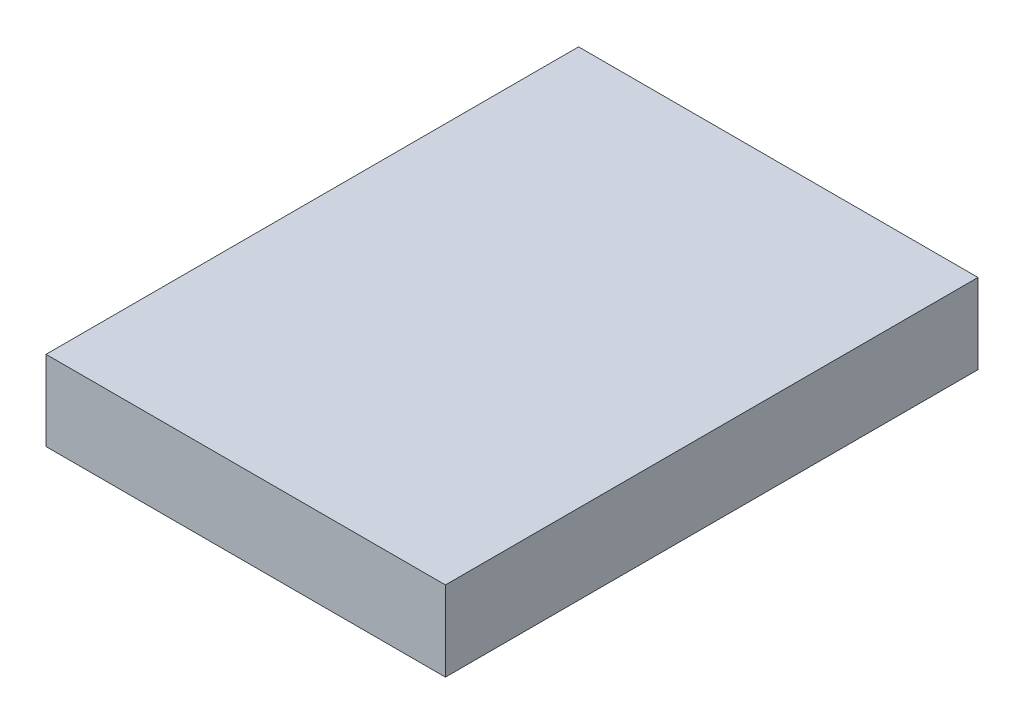
ISO-10303-21;
HEADER;
FILE_DESCRIPTION(('STEP AP214'),'2;1');
FILE_NAME('part.step','',(''),(''),'','','');
FILE_SCHEMA(('AUTOMOTIVE_DESIGN { 1 0 10303 214 1 1 1 1 }'));
ENDSEC;
DATA;
#1=APPLICATION_CONTEXT('core data for automotive mechanical design processes');
#2=APPLICATION_PROTOCOL_DEFINITION('international standard','automotive_design',2000,#1);
#3=PRODUCT_CONTEXT('',#1,'mechanical');
#4=PRODUCT('Part','Part','',(#3));
#5=PRODUCT_RELATED_PRODUCT_CATEGORY('part','',(#4));
#6=PRODUCT_DEFINITION_FORMATION('','',#4);
#7=PRODUCT_DEFINITION_CONTEXT('part definition',#1,'design');
#8=PRODUCT_DEFINITION('design','',#6,#7);
#9=PRODUCT_DEFINITION_SHAPE('','',#8);
#10=(LENGTH_UNIT() NAMED_UNIT(*) SI_UNIT(.MILLI.,.METRE.));
#11=(NAMED_UNIT(*) PLANE_ANGLE_UNIT() SI_UNIT($,.RADIAN.));
#12=(NAMED_UNIT(*) SI_UNIT($,.STERADIAN.) SOLID_ANGLE_UNIT());
#13=UNCERTAINTY_MEASURE_WITH_UNIT(LENGTH_MEASURE(1.E-05),#10,'distance_accuracy_value','');
#14=(GEOMETRIC_REPRESENTATION_CONTEXT(3) GLOBAL_UNCERTAINTY_ASSIGNED_CONTEXT((#13)) GLOBAL_UNIT_ASSIGNED_CONTEXT((#10,
#11,#12)) REPRESENTATION_CONTEXT('',''));
#15=CARTESIAN_POINT('',(0.,0.,0.));
#16=DIRECTION('',(0.,0.,1.));
#17=DIRECTION('',(1.,0.,0.));
#18=AXIS2_PLACEMENT_3D('',#15,#16,#17);
#19=CARTESIAN_POINT('',(37.5,7.5,50.));
#20=DIRECTION('',(-1.,0.,0.));
#21=DIRECTION('',(0.,-1.,0.));
#22=AXIS2_PLACEMENT_3D('',#19,#20,#21);
#23=PLANE('',#22);
#24=DIRECTION('',(0.,1.,0.));
#25=VECTOR('',#24,1.);
#26=CARTESIAN_POINT('',(37.5,7.5,-50.));
#27=LINE('',#26,#25);
#28=CARTESIAN_POINT('',(37.5,-7.5,-50.));
#29=VERTEX_POINT('',#28);
#30=CARTESIAN_POINT('',(37.5,7.5,-50.));
#31=VERTEX_POINT('',#30);
#32=EDGE_CURVE('E107',#29,#31,#27,.T.);
#33=ORIENTED_EDGE('',*,*,#32,.T.);
#34=DIRECTION('',(0.,0.,-1.));
#35=VECTOR('',#34,1.);
#36=CARTESIAN_POINT('',(37.5,7.5,50.));
#37=LINE('',#36,#35);
#38=CARTESIAN_POINT('',(37.5,7.5,50.));
#39=VERTEX_POINT('',#38);
#40=EDGE_CURVE('E11',#39,#31,#37,.T.);
#41=ORIENTED_EDGE('',*,*,#40,.F.);
#42=DIRECTION('',(0.,1.,0.));
#43=VECTOR('',#42,1.);
#44=CARTESIAN_POINT('',(37.5,7.5,50.));
#45=LINE('',#44,#43);
#46=CARTESIAN_POINT('',(37.5,-7.5,50.));
#47=VERTEX_POINT('',#46);
#48=EDGE_CURVE('E91',#47,#39,#45,.T.);
#49=ORIENTED_EDGE('',*,*,#48,.F.);
#50=DIRECTION('',(0.,0.,-1.));
#51=VECTOR('',#50,1.);
#52=CARTESIAN_POINT('',(37.5,-7.5,50.));
#53=LINE('',#52,#51);
#54=EDGE_CURVE('E103',#47,#29,#53,.T.);
#55=ORIENTED_EDGE('',*,*,#54,.T.);
#56=EDGE_LOOP('',(#33,#41,#49,#55));
#57=FACE_BOUND('',#56,.T.);
#58=ADVANCED_FACE('F39',(#57),#23,.F.);
#59=CARTESIAN_POINT('',(-37.5,7.5,50.));
#60=DIRECTION('',(0.,-1.,0.));
#61=DIRECTION('',(0.,0.,-1.));
#62=AXIS2_PLACEMENT_3D('',#59,#60,#61);
#63=PLANE('',#62);
#64=DIRECTION('',(-1.,0.,0.));
#65=VECTOR('',#64,1.);
#66=CARTESIAN_POINT('',(-37.5,7.5,-50.));
#67=LINE('',#66,#65);
#68=CARTESIAN_POINT('',(-37.5,7.5,-50.));
#69=VERTEX_POINT('',#68);
#70=EDGE_CURVE('E96',#31,#69,#67,.T.);
#71=ORIENTED_EDGE('',*,*,#70,.T.);
#72=DIRECTION('',(0.,0.,-1.));
#73=VECTOR('',#72,1.);
#74=CARTESIAN_POINT('',(-37.5,7.5,50.));
#75=LINE('',#74,#73);
#76=CARTESIAN_POINT('',(-37.5,7.5,50.));
#77=VERTEX_POINT('',#76);
#78=EDGE_CURVE('E48',#77,#69,#75,.T.);
#79=ORIENTED_EDGE('',*,*,#78,.F.);
#80=DIRECTION('',(-1.,0.,0.));
#81=VECTOR('',#80,1.);
#82=CARTESIAN_POINT('',(-37.5,7.5,50.));
#83=LINE('',#82,#81);
#84=EDGE_CURVE('E86',#39,#77,#83,.T.);
#85=ORIENTED_EDGE('',*,*,#84,.F.);
#86=ORIENTED_EDGE('',*,*,#40,.T.);
#87=EDGE_LOOP('',(#71,#79,#85,#86));
#88=FACE_BOUND('',#87,.T.);
#89=ADVANCED_FACE('F95',(#88),#63,.F.);
#90=CARTESIAN_POINT('',(-37.5,7.5,50.));
#91=DIRECTION('',(1.,0.,0.));
#92=DIRECTION('',(0.,1.,0.));
#93=AXIS2_PLACEMENT_3D('',#90,#91,#92);
#94=PLANE('',#93);
#95=DIRECTION('',(0.,-1.,0.));
#96=VECTOR('',#95,1.);
#97=CARTESIAN_POINT('',(-37.5,7.5,-50.));
#98=LINE('',#97,#96);
#99=CARTESIAN_POINT('',(-37.5,-7.5,-50.));
#100=VERTEX_POINT('',#99);
#101=EDGE_CURVE('E73',#69,#100,#98,.T.);
#102=ORIENTED_EDGE('',*,*,#101,.T.);
#103=DIRECTION('',(0.,0.,-1.));
#104=VECTOR('',#103,1.);
#105=CARTESIAN_POINT('',(-37.5,-7.5,50.));
#106=LINE('',#105,#104);
#107=CARTESIAN_POINT('',(-37.5,-7.5,50.));
#108=VERTEX_POINT('',#107);
#109=EDGE_CURVE('E98',#108,#100,#106,.T.);
#110=ORIENTED_EDGE('',*,*,#109,.F.);
#111=DIRECTION('',(0.,-1.,0.));
#112=VECTOR('',#111,1.);
#113=CARTESIAN_POINT('',(-37.5,7.5,50.));
#114=LINE('',#113,#112);
#115=EDGE_CURVE('E89',#77,#108,#114,.T.);
#116=ORIENTED_EDGE('',*,*,#115,.F.);
#117=ORIENTED_EDGE('',*,*,#78,.T.);
#118=EDGE_LOOP('',(#102,#110,#116,#117));
#119=FACE_BOUND('',#118,.T.);
#120=ADVANCED_FACE('F99',(#119),#94,.F.);
#121=CARTESIAN_POINT('',(-37.5,-7.5,50.));
#122=DIRECTION('',(0.,1.,0.));
#123=DIRECTION('',(0.,0.,1.));
#124=AXIS2_PLACEMENT_3D('',#121,#122,#123);
#125=PLANE('',#124);
#126=DIRECTION('',(1.,0.,0.));
#127=VECTOR('',#126,1.);
#128=CARTESIAN_POINT('',(-37.5,-7.5,-50.));
#129=LINE('',#128,#127);
#130=EDGE_CURVE('E79',#100,#29,#129,.T.);
#131=ORIENTED_EDGE('',*,*,#130,.T.);
#132=ORIENTED_EDGE('',*,*,#54,.F.);
#133=DIRECTION('',(1.,0.,0.));
#134=VECTOR('',#133,1.);
#135=CARTESIAN_POINT('',(-37.5,-7.5,50.));
#136=LINE('',#135,#134);
#137=EDGE_CURVE('E56',#108,#47,#136,.T.);
#138=ORIENTED_EDGE('',*,*,#137,.F.);
#139=ORIENTED_EDGE('',*,*,#109,.T.);
#140=EDGE_LOOP('',(#131,#132,#138,#139));
#141=FACE_BOUND('',#140,.T.);
#142=ADVANCED_FACE('F120',(#141),#125,.F.);
#143=CARTESIAN_POINT('',(0.,0.,50.));
#144=DIRECTION('',(0.,0.,1.));
#145=DIRECTION('',(1.,0.,0.));
#146=AXIS2_PLACEMENT_3D('',#143,#144,#145);
#147=PLANE('',#146);
#148=ORIENTED_EDGE('',*,*,#48,.T.);
#149=ORIENTED_EDGE('',*,*,#84,.T.);
#150=ORIENTED_EDGE('',*,*,#115,.T.);
#151=ORIENTED_EDGE('',*,*,#137,.T.);
#152=EDGE_LOOP('',(#148,#149,#150,#151));
#153=FACE_BOUND('',#152,.T.);
#154=ADVANCED_FACE('F87',(#153),#147,.T.);
#155=CARTESIAN_POINT('',(0.,0.,-50.));
#156=DIRECTION('',(0.,0.,1.));
#157=DIRECTION('',(1.,0.,0.));
#158=AXIS2_PLACEMENT_3D('',#155,#156,#157);
#159=PLANE('',#158);
#160=ORIENTED_EDGE('',*,*,#32,.F.);
#161=ORIENTED_EDGE('',*,*,#130,.F.);
#162=ORIENTED_EDGE('',*,*,#101,.F.);
#163=ORIENTED_EDGE('',*,*,#70,.F.);
#164=EDGE_LOOP('',(#160,#161,#162,#163));
#165=FACE_BOUND('',#164,.T.);
#166=ADVANCED_FACE('F123',(#165),#159,.F.);
#167=CLOSED_SHELL('',(#58,#89,#120,#142,#154,#166));
#168=MANIFOLD_SOLID_BREP('B2',#167);
#169=ADVANCED_BREP_SHAPE_REPRESENTATION('',(#18,#168),#14);
#170=SHAPE_DEFINITION_REPRESENTATION(#9,#169);
ENDSEC;
END-ISO-10303-21;
